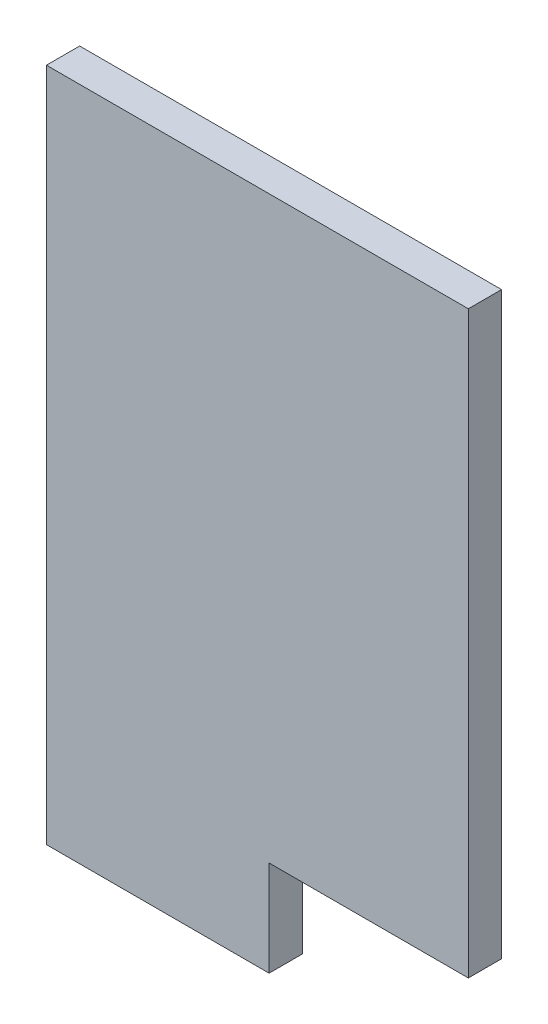
ISO-10303-21;
HEADER;
FILE_DESCRIPTION(('STEP AP214'),'2;1');
FILE_NAME('part.step','',(''),(''),'','','');
FILE_SCHEMA(('AUTOMOTIVE_DESIGN { 1 0 10303 214 1 1 1 1 }'));
ENDSEC;
DATA;
#1=APPLICATION_CONTEXT('core data for automotive mechanical design processes');
#2=APPLICATION_PROTOCOL_DEFINITION('international standard','automotive_design',2000,#1);
#3=PRODUCT_CONTEXT('',#1,'mechanical');
#4=PRODUCT('Part','Part','',(#3));
#5=PRODUCT_RELATED_PRODUCT_CATEGORY('part','',(#4));
#6=PRODUCT_DEFINITION_FORMATION('','',#4);
#7=PRODUCT_DEFINITION_CONTEXT('part definition',#1,'design');
#8=PRODUCT_DEFINITION('design','',#6,#7);
#9=PRODUCT_DEFINITION_SHAPE('','',#8);
#10=(LENGTH_UNIT() NAMED_UNIT(*) SI_UNIT(.MILLI.,.METRE.));
#11=(NAMED_UNIT(*) PLANE_ANGLE_UNIT() SI_UNIT($,.RADIAN.));
#12=(NAMED_UNIT(*) SI_UNIT($,.STERADIAN.) SOLID_ANGLE_UNIT());
#13=UNCERTAINTY_MEASURE_WITH_UNIT(LENGTH_MEASURE(1.E-05),#10,'distance_accuracy_value','');
#14=(GEOMETRIC_REPRESENTATION_CONTEXT(3) GLOBAL_UNCERTAINTY_ASSIGNED_CONTEXT((#13)) GLOBAL_UNIT_ASSIGNED_CONTEXT((#10,
#11,#12)) REPRESENTATION_CONTEXT('',''));
#15=CARTESIAN_POINT('',(0.,0.,0.));
#16=DIRECTION('',(0.,0.,1.));
#17=DIRECTION('',(1.,0.,0.));
#18=AXIS2_PLACEMENT_3D('',#15,#16,#17);
#19=CARTESIAN_POINT('',(5.588,9.1948,1.6002));
#20=DIRECTION('',(0.,-1.,0.));
#21=DIRECTION('',(1.,0.,0.));
#22=AXIS2_PLACEMENT_3D('',#19,#20,#21);
#23=PLANE('',#22);
#24=DIRECTION('',(-1.,0.,0.));
#25=VECTOR('',#24,1.);
#26=CARTESIAN_POINT('',(5.588,9.1948,0.));
#27=LINE('',#26,#25);
#28=CARTESIAN_POINT('',(5.588,9.1948,0.));
#29=VERTEX_POINT('',#28);
#30=CARTESIAN_POINT('',(-14.732,9.1948,0.));
#31=VERTEX_POINT('',#30);
#32=EDGE_CURVE('E117',#29,#31,#27,.T.);
#33=ORIENTED_EDGE('',*,*,#32,.T.);
#34=DIRECTION('',(0.,0.,-1.));
#35=VECTOR('',#34,1.);
#36=CARTESIAN_POINT('',(-14.732,9.1948,1.6002));
#37=LINE('',#36,#35);
#38=CARTESIAN_POINT('',(-14.732,9.1948,1.6002));
#39=VERTEX_POINT('',#38);
#40=EDGE_CURVE('E11',#39,#31,#37,.T.);
#41=ORIENTED_EDGE('',*,*,#40,.F.);
#42=DIRECTION('',(-1.,0.,0.));
#43=VECTOR('',#42,1.);
#44=CARTESIAN_POINT('',(5.588,9.1948,1.6002));
#45=LINE('',#44,#43);
#46=CARTESIAN_POINT('',(5.588,9.1948,1.6002));
#47=VERTEX_POINT('',#46);
#48=EDGE_CURVE('E127',#47,#39,#45,.T.);
#49=ORIENTED_EDGE('',*,*,#48,.F.);
#50=DIRECTION('',(0.,0.,-1.));
#51=VECTOR('',#50,1.);
#52=CARTESIAN_POINT('',(5.588,9.1948,1.6002));
#53=LINE('',#52,#51);
#54=EDGE_CURVE('E113',#47,#29,#53,.T.);
#55=ORIENTED_EDGE('',*,*,#54,.T.);
#56=EDGE_LOOP('',(#33,#41,#49,#55));
#57=FACE_BOUND('',#56,.T.);
#58=ADVANCED_FACE('F33',(#57),#23,.F.);
#59=CARTESIAN_POINT('',(-14.732,9.1948,1.6002));
#60=DIRECTION('',(1.,0.,0.));
#61=DIRECTION('',(0.,1.,0.));
#62=AXIS2_PLACEMENT_3D('',#59,#60,#61);
#63=PLANE('',#62);
#64=DIRECTION('',(0.,-1.,0.));
#65=VECTOR('',#64,1.);
#66=CARTESIAN_POINT('',(-14.732,9.1948,0.));
#67=LINE('',#66,#65);
#68=CARTESIAN_POINT('',(-14.732,-23.3172,0.));
#69=VERTEX_POINT('',#68);
#70=EDGE_CURVE('E120',#31,#69,#67,.T.);
#71=ORIENTED_EDGE('',*,*,#70,.T.);
#72=DIRECTION('',(0.,0.,-1.));
#73=VECTOR('',#72,1.);
#74=CARTESIAN_POINT('',(-14.732,-23.3172,1.6002));
#75=LINE('',#74,#73);
#76=CARTESIAN_POINT('',(-14.732,-23.3172,1.6002));
#77=VERTEX_POINT('',#76);
#78=EDGE_CURVE('E41',#77,#69,#75,.T.);
#79=ORIENTED_EDGE('',*,*,#78,.F.);
#80=DIRECTION('',(0.,-1.,0.));
#81=VECTOR('',#80,1.);
#82=CARTESIAN_POINT('',(-14.732,9.1948,1.6002));
#83=LINE('',#82,#81);
#84=EDGE_CURVE('E86',#39,#77,#83,.T.);
#85=ORIENTED_EDGE('',*,*,#84,.F.);
#86=ORIENTED_EDGE('',*,*,#40,.T.);
#87=EDGE_LOOP('',(#71,#79,#85,#86));
#88=FACE_BOUND('',#87,.T.);
#89=ADVANCED_FACE('F151',(#88),#63,.F.);
#90=CARTESIAN_POINT('',(-14.732,-23.3172,1.6002));
#91=DIRECTION('',(0.,1.,0.));
#92=DIRECTION('',(0.,0.,1.));
#93=AXIS2_PLACEMENT_3D('',#90,#91,#92);
#94=PLANE('',#93);
#95=DIRECTION('',(1.,0.,0.));
#96=VECTOR('',#95,1.);
#97=CARTESIAN_POINT('',(-14.732,-23.3172,0.));
#98=LINE('',#97,#96);
#99=CARTESIAN_POINT('',(-4.008,-23.3172,0.));
#100=VERTEX_POINT('',#99);
#101=EDGE_CURVE('E122',#69,#100,#98,.T.);
#102=ORIENTED_EDGE('',*,*,#101,.T.);
#103=DIRECTION('',(0.,0.,-1.));
#104=VECTOR('',#103,1.);
#105=CARTESIAN_POINT('',(-4.008,-23.3172,1.6002));
#106=LINE('',#105,#104);
#107=CARTESIAN_POINT('',(-4.008,-23.3172,1.6002));
#108=VERTEX_POINT('',#107);
#109=EDGE_CURVE('E108',#108,#100,#106,.T.);
#110=ORIENTED_EDGE('',*,*,#109,.F.);
#111=DIRECTION('',(1.,0.,0.));
#112=VECTOR('',#111,1.);
#113=CARTESIAN_POINT('',(-14.732,-23.3172,1.6002));
#114=LINE('',#113,#112);
#115=EDGE_CURVE('E99',#77,#108,#114,.T.);
#116=ORIENTED_EDGE('',*,*,#115,.F.);
#117=ORIENTED_EDGE('',*,*,#78,.T.);
#118=EDGE_LOOP('',(#102,#110,#116,#117));
#119=FACE_BOUND('',#118,.T.);
#120=ADVANCED_FACE('F133',(#119),#94,.F.);
#121=CARTESIAN_POINT('',(-4.008,-23.3172,1.6002));
#122=DIRECTION('',(-1.,0.,0.));
#123=DIRECTION('',(0.,0.,1.));
#124=AXIS2_PLACEMENT_3D('',#121,#122,#123);
#125=PLANE('',#124);
#126=DIRECTION('',(0.,1.,0.));
#127=VECTOR('',#126,1.);
#128=CARTESIAN_POINT('',(-4.008,-23.3172,0.));
#129=LINE('',#128,#127);
#130=CARTESIAN_POINT('',(-4.008,-18.7198,0.));
#131=VERTEX_POINT('',#130);
#132=EDGE_CURVE('E107',#100,#131,#129,.T.);
#133=ORIENTED_EDGE('',*,*,#132,.T.);
#134=DIRECTION('',(0.,0.,-1.));
#135=VECTOR('',#134,1.);
#136=CARTESIAN_POINT('',(-4.008,-18.7198,1.6002));
#137=LINE('',#136,#135);
#138=CARTESIAN_POINT('',(-4.008,-18.7198,1.6002));
#139=VERTEX_POINT('',#138);
#140=EDGE_CURVE('E104',#139,#131,#137,.T.);
#141=ORIENTED_EDGE('',*,*,#140,.F.);
#142=DIRECTION('',(0.,1.,0.));
#143=VECTOR('',#142,1.);
#144=CARTESIAN_POINT('',(-4.008,-23.3172,1.6002));
#145=LINE('',#144,#143);
#146=EDGE_CURVE('E93',#108,#139,#145,.T.);
#147=ORIENTED_EDGE('',*,*,#146,.F.);
#148=ORIENTED_EDGE('',*,*,#109,.T.);
#149=EDGE_LOOP('',(#133,#141,#147,#148));
#150=FACE_BOUND('',#149,.T.);
#151=ADVANCED_FACE('F105',(#150),#125,.F.);
#152=CARTESIAN_POINT('',(-4.008,-18.7198,1.6002));
#153=DIRECTION('',(0.,1.,0.));
#154=DIRECTION('',(0.,0.,1.));
#155=AXIS2_PLACEMENT_3D('',#152,#153,#154);
#156=PLANE('',#155);
#157=DIRECTION('',(1.,0.,0.));
#158=VECTOR('',#157,1.);
#159=CARTESIAN_POINT('',(-4.008,-18.7198,0.));
#160=LINE('',#159,#158);
#161=CARTESIAN_POINT('',(5.588,-18.7198,0.));
#162=VERTEX_POINT('',#161);
#163=EDGE_CURVE('E72',#131,#162,#160,.T.);
#164=ORIENTED_EDGE('',*,*,#163,.T.);
#165=DIRECTION('',(0.,0.,-1.));
#166=VECTOR('',#165,1.);
#167=CARTESIAN_POINT('',(5.588,-18.7198,1.6002));
#168=LINE('',#167,#166);
#169=CARTESIAN_POINT('',(5.588,-18.7198,1.6002));
#170=VERTEX_POINT('',#169);
#171=EDGE_CURVE('E109',#170,#162,#168,.T.);
#172=ORIENTED_EDGE('',*,*,#171,.F.);
#173=DIRECTION('',(1.,0.,0.));
#174=VECTOR('',#173,1.);
#175=CARTESIAN_POINT('',(-4.008,-18.7198,1.6002));
#176=LINE('',#175,#174);
#177=EDGE_CURVE('E97',#139,#170,#176,.T.);
#178=ORIENTED_EDGE('',*,*,#177,.F.);
#179=ORIENTED_EDGE('',*,*,#140,.T.);
#180=EDGE_LOOP('',(#164,#172,#178,#179));
#181=FACE_BOUND('',#180,.T.);
#182=ADVANCED_FACE('F111',(#181),#156,.F.);
#183=CARTESIAN_POINT('',(5.588,-18.7198,1.6002));
#184=DIRECTION('',(-1.,0.,0.));
#185=DIRECTION('',(0.,-1.,0.));
#186=AXIS2_PLACEMENT_3D('',#183,#184,#185);
#187=PLANE('',#186);
#188=DIRECTION('',(0.,1.,0.));
#189=VECTOR('',#188,1.);
#190=CARTESIAN_POINT('',(5.588,-18.7198,0.));
#191=LINE('',#190,#189);
#192=EDGE_CURVE('E78',#162,#29,#191,.T.);
#193=ORIENTED_EDGE('',*,*,#192,.T.);
#194=ORIENTED_EDGE('',*,*,#54,.F.);
#195=DIRECTION('',(0.,1.,0.));
#196=VECTOR('',#195,1.);
#197=CARTESIAN_POINT('',(5.588,-18.7198,1.6002));
#198=LINE('',#197,#196);
#199=EDGE_CURVE('E49',#170,#47,#198,.T.);
#200=ORIENTED_EDGE('',*,*,#199,.F.);
#201=ORIENTED_EDGE('',*,*,#171,.T.);
#202=EDGE_LOOP('',(#193,#194,#200,#201));
#203=FACE_BOUND('',#202,.T.);
#204=ADVANCED_FACE('F140',(#203),#187,.F.);
#205=CARTESIAN_POINT('',(0.,0.,1.6002));
#206=DIRECTION('',(0.,0.,1.));
#207=DIRECTION('',(1.,0.,0.));
#208=AXIS2_PLACEMENT_3D('',#205,#206,#207);
#209=PLANE('',#208);
#210=ORIENTED_EDGE('',*,*,#48,.T.);
#211=ORIENTED_EDGE('',*,*,#84,.T.);
#212=ORIENTED_EDGE('',*,*,#115,.T.);
#213=ORIENTED_EDGE('',*,*,#146,.T.);
#214=ORIENTED_EDGE('',*,*,#177,.T.);
#215=ORIENTED_EDGE('',*,*,#199,.T.);
#216=EDGE_LOOP('',(#210,#211,#212,#213,#214,#215));
#217=FACE_BOUND('',#216,.T.);
#218=ADVANCED_FACE('F95',(#217),#209,.T.);
#219=CARTESIAN_POINT('',(0.,0.,0.));
#220=DIRECTION('',(0.,0.,1.));
#221=DIRECTION('',(1.,0.,0.));
#222=AXIS2_PLACEMENT_3D('',#219,#220,#221);
#223=PLANE('',#222);
#224=ORIENTED_EDGE('',*,*,#32,.F.);
#225=ORIENTED_EDGE('',*,*,#192,.F.);
#226=ORIENTED_EDGE('',*,*,#163,.F.);
#227=ORIENTED_EDGE('',*,*,#132,.F.);
#228=ORIENTED_EDGE('',*,*,#101,.F.);
#229=ORIENTED_EDGE('',*,*,#70,.F.);
#230=EDGE_LOOP('',(#224,#225,#226,#227,#228,#229));
#231=FACE_BOUND('',#230,.T.);
#232=ADVANCED_FACE('F136',(#231),#223,.F.);
#233=CLOSED_SHELL('',(#58,#89,#120,#151,#182,#204,#218,#232));
#234=MANIFOLD_SOLID_BREP('B2',#233);
#235=ADVANCED_BREP_SHAPE_REPRESENTATION('',(#18,#234),#14);
#236=SHAPE_DEFINITION_REPRESENTATION(#9,#235);
ENDSEC;
END-ISO-10303-21;
